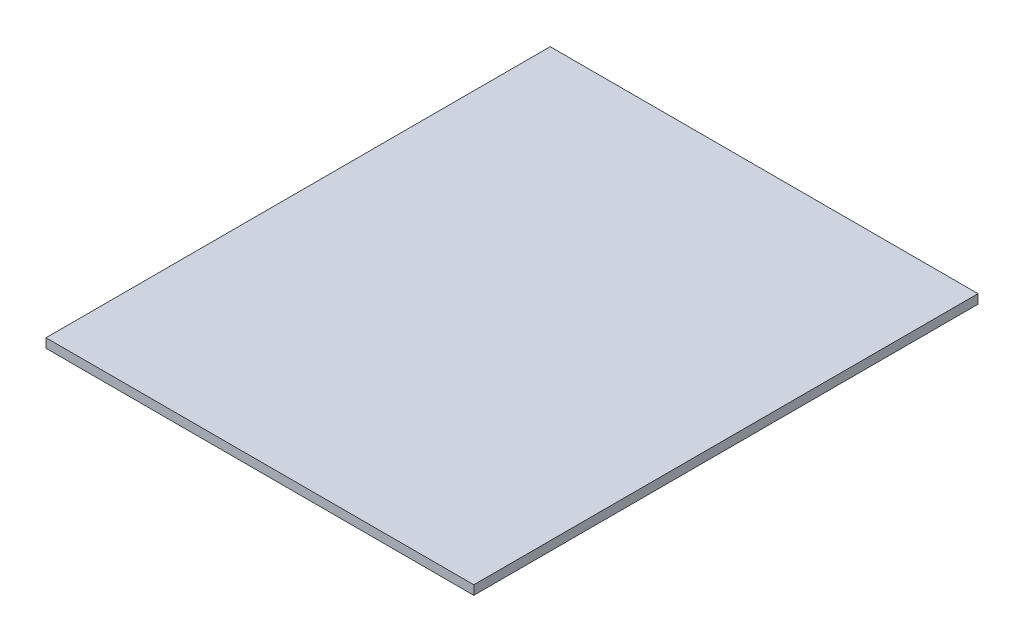
ISO-10303-21;
HEADER;
FILE_DESCRIPTION(('STEP AP214'),'2;1');
FILE_NAME('part.step','',(''),(''),'','','');
FILE_SCHEMA(('AUTOMOTIVE_DESIGN { 1 0 10303 214 1 1 1 1 }'));
ENDSEC;
DATA;
#1=APPLICATION_CONTEXT('core data for automotive mechanical design processes');
#2=APPLICATION_PROTOCOL_DEFINITION('international standard','automotive_design',2000,#1);
#3=PRODUCT_CONTEXT('',#1,'mechanical');
#4=PRODUCT('Part','Part','',(#3));
#5=PRODUCT_RELATED_PRODUCT_CATEGORY('part','',(#4));
#6=PRODUCT_DEFINITION_FORMATION('','',#4);
#7=PRODUCT_DEFINITION_CONTEXT('part definition',#1,'design');
#8=PRODUCT_DEFINITION('design','',#6,#7);
#9=PRODUCT_DEFINITION_SHAPE('','',#8);
#10=(LENGTH_UNIT() NAMED_UNIT(*) SI_UNIT(.MILLI.,.METRE.));
#11=(NAMED_UNIT(*) PLANE_ANGLE_UNIT() SI_UNIT($,.RADIAN.));
#12=(NAMED_UNIT(*) SI_UNIT($,.STERADIAN.) SOLID_ANGLE_UNIT());
#13=UNCERTAINTY_MEASURE_WITH_UNIT(LENGTH_MEASURE(1.E-05),#10,'distance_accuracy_value','');
#14=(GEOMETRIC_REPRESENTATION_CONTEXT(3) GLOBAL_UNCERTAINTY_ASSIGNED_CONTEXT((#13)) GLOBAL_UNIT_ASSIGNED_CONTEXT((#10,
#11,#12)) REPRESENTATION_CONTEXT('',''));
#15=CARTESIAN_POINT('',(0.,0.,0.));
#16=DIRECTION('',(0.,0.,1.));
#17=DIRECTION('',(1.,0.,0.));
#18=AXIS2_PLACEMENT_3D('',#15,#16,#17);
#19=CARTESIAN_POINT('',(-70.,3.,-82.5));
#20=DIRECTION('',(1.,0.,0.));
#21=DIRECTION('',(0.,0.,-1.));
#22=AXIS2_PLACEMENT_3D('',#19,#20,#21);
#23=PLANE('',#22);
#24=DIRECTION('',(0.,0.,1.));
#25=VECTOR('',#24,1.);
#26=CARTESIAN_POINT('',(-70.,0.,-82.5));
#27=LINE('',#26,#25);
#28=CARTESIAN_POINT('',(-70.,0.,-82.5));
#29=VERTEX_POINT('',#28);
#30=CARTESIAN_POINT('',(-70.,0.,82.5));
#31=VERTEX_POINT('',#30);
#32=EDGE_CURVE('E96',#29,#31,#27,.T.);
#33=ORIENTED_EDGE('',*,*,#32,.T.);
#34=DIRECTION('',(0.,-1.,0.));
#35=VECTOR('',#34,1.);
#36=CARTESIAN_POINT('',(-70.,3.,82.5));
#37=LINE('',#36,#35);
#38=CARTESIAN_POINT('',(-70.,3.,82.5));
#39=VERTEX_POINT('',#38);
#40=EDGE_CURVE('E11',#39,#31,#37,.T.);
#41=ORIENTED_EDGE('',*,*,#40,.F.);
#42=DIRECTION('',(0.,0.,1.));
#43=VECTOR('',#42,1.);
#44=CARTESIAN_POINT('',(-70.,3.,-82.5));
#45=LINE('',#44,#43);
#46=CARTESIAN_POINT('',(-70.,3.,-82.5));
#47=VERTEX_POINT('',#46);
#48=EDGE_CURVE('E84',#47,#39,#45,.T.);
#49=ORIENTED_EDGE('',*,*,#48,.F.);
#50=DIRECTION('',(0.,-1.,0.));
#51=VECTOR('',#50,1.);
#52=CARTESIAN_POINT('',(-70.,3.,-82.5));
#53=LINE('',#52,#51);
#54=EDGE_CURVE('E92',#47,#29,#53,.T.);
#55=ORIENTED_EDGE('',*,*,#54,.T.);
#56=EDGE_LOOP('',(#33,#41,#49,#55));
#57=FACE_BOUND('',#56,.T.);
#58=ADVANCED_FACE('F33',(#57),#23,.F.);
#59=CARTESIAN_POINT('',(70.,3.,82.5));
#60=DIRECTION('',(0.,0.,-1.));
#61=DIRECTION('',(-1.,0.,0.));
#62=AXIS2_PLACEMENT_3D('',#59,#60,#61);
#63=PLANE('',#62);
#64=DIRECTION('',(1.,0.,0.));
#65=VECTOR('',#64,1.);
#66=CARTESIAN_POINT('',(70.,0.,82.5));
#67=LINE('',#66,#65);
#68=CARTESIAN_POINT('',(70.,0.,82.5));
#69=VERTEX_POINT('',#68);
#70=EDGE_CURVE('E88',#31,#69,#67,.T.);
#71=ORIENTED_EDGE('',*,*,#70,.T.);
#72=DIRECTION('',(0.,-1.,0.));
#73=VECTOR('',#72,1.);
#74=CARTESIAN_POINT('',(70.,3.,82.5));
#75=LINE('',#74,#73);
#76=CARTESIAN_POINT('',(70.,3.,82.5));
#77=VERTEX_POINT('',#76);
#78=EDGE_CURVE('E41',#77,#69,#75,.T.);
#79=ORIENTED_EDGE('',*,*,#78,.F.);
#80=DIRECTION('',(1.,0.,0.));
#81=VECTOR('',#80,1.);
#82=CARTESIAN_POINT('',(70.,3.,82.5));
#83=LINE('',#82,#81);
#84=EDGE_CURVE('E79',#39,#77,#83,.T.);
#85=ORIENTED_EDGE('',*,*,#84,.F.);
#86=ORIENTED_EDGE('',*,*,#40,.T.);
#87=EDGE_LOOP('',(#71,#79,#85,#86));
#88=FACE_BOUND('',#87,.T.);
#89=ADVANCED_FACE('F87',(#88),#63,.F.);
#90=CARTESIAN_POINT('',(70.,3.,-82.5));
#91=DIRECTION('',(-1.,0.,0.));
#92=DIRECTION('',(0.,0.,1.));
#93=AXIS2_PLACEMENT_3D('',#90,#91,#92);
#94=PLANE('',#93);
#95=DIRECTION('',(0.,0.,-1.));
#96=VECTOR('',#95,1.);
#97=CARTESIAN_POINT('',(70.,0.,-82.5));
#98=LINE('',#97,#96);
#99=CARTESIAN_POINT('',(70.,0.,-82.5));
#100=VERTEX_POINT('',#99);
#101=EDGE_CURVE('E66',#69,#100,#98,.T.);
#102=ORIENTED_EDGE('',*,*,#101,.T.);
#103=DIRECTION('',(0.,-1.,0.));
#104=VECTOR('',#103,1.);
#105=CARTESIAN_POINT('',(70.,3.,-82.5));
#106=LINE('',#105,#104);
#107=CARTESIAN_POINT('',(70.,3.,-82.5));
#108=VERTEX_POINT('',#107);
#109=EDGE_CURVE('E89',#108,#100,#106,.T.);
#110=ORIENTED_EDGE('',*,*,#109,.F.);
#111=DIRECTION('',(0.,0.,-1.));
#112=VECTOR('',#111,1.);
#113=CARTESIAN_POINT('',(70.,3.,-82.5));
#114=LINE('',#113,#112);
#115=EDGE_CURVE('E82',#77,#108,#114,.T.);
#116=ORIENTED_EDGE('',*,*,#115,.F.);
#117=ORIENTED_EDGE('',*,*,#78,.T.);
#118=EDGE_LOOP('',(#102,#110,#116,#117));
#119=FACE_BOUND('',#118,.T.);
#120=ADVANCED_FACE('F90',(#119),#94,.F.);
#121=CARTESIAN_POINT('',(70.,3.,-82.5));
#122=DIRECTION('',(0.,0.,1.));
#123=DIRECTION('',(1.,0.,0.));
#124=AXIS2_PLACEMENT_3D('',#121,#122,#123);
#125=PLANE('',#124);
#126=DIRECTION('',(-1.,0.,0.));
#127=VECTOR('',#126,1.);
#128=CARTESIAN_POINT('',(70.,0.,-82.5));
#129=LINE('',#128,#127);
#130=EDGE_CURVE('E72',#100,#29,#129,.T.);
#131=ORIENTED_EDGE('',*,*,#130,.T.);
#132=ORIENTED_EDGE('',*,*,#54,.F.);
#133=DIRECTION('',(-1.,0.,0.));
#134=VECTOR('',#133,1.);
#135=CARTESIAN_POINT('',(70.,3.,-82.5));
#136=LINE('',#135,#134);
#137=EDGE_CURVE('E49',#108,#47,#136,.T.);
#138=ORIENTED_EDGE('',*,*,#137,.F.);
#139=ORIENTED_EDGE('',*,*,#109,.T.);
#140=EDGE_LOOP('',(#131,#132,#138,#139));
#141=FACE_BOUND('',#140,.T.);
#142=ADVANCED_FACE('F103',(#141),#125,.F.);
#143=CARTESIAN_POINT('',(0.,3.,0.));
#144=DIRECTION('',(0.,-1.,0.));
#145=DIRECTION('',(0.,0.,-1.));
#146=AXIS2_PLACEMENT_3D('',#143,#144,#145);
#147=PLANE('',#146);
#148=ORIENTED_EDGE('',*,*,#48,.T.);
#149=ORIENTED_EDGE('',*,*,#84,.T.);
#150=ORIENTED_EDGE('',*,*,#115,.T.);
#151=ORIENTED_EDGE('',*,*,#137,.T.);
#152=EDGE_LOOP('',(#148,#149,#150,#151));
#153=FACE_BOUND('',#152,.T.);
#154=ADVANCED_FACE('F80',(#153),#147,.F.);
#155=CARTESIAN_POINT('',(0.,0.,0.));
#156=DIRECTION('',(0.,-1.,0.));
#157=DIRECTION('',(0.,0.,-1.));
#158=AXIS2_PLACEMENT_3D('',#155,#156,#157);
#159=PLANE('',#158);
#160=ORIENTED_EDGE('',*,*,#32,.F.);
#161=ORIENTED_EDGE('',*,*,#130,.F.);
#162=ORIENTED_EDGE('',*,*,#101,.F.);
#163=ORIENTED_EDGE('',*,*,#70,.F.);
#164=EDGE_LOOP('',(#160,#161,#162,#163));
#165=FACE_BOUND('',#164,.T.);
#166=ADVANCED_FACE('F106',(#165),#159,.T.);
#167=CLOSED_SHELL('',(#58,#89,#120,#142,#154,#166));
#168=MANIFOLD_SOLID_BREP('B2',#167);
#169=ADVANCED_BREP_SHAPE_REPRESENTATION('',(#18,#168),#14);
#170=SHAPE_DEFINITION_REPRESENTATION(#9,#169);
ENDSEC;
END-ISO-10303-21;
